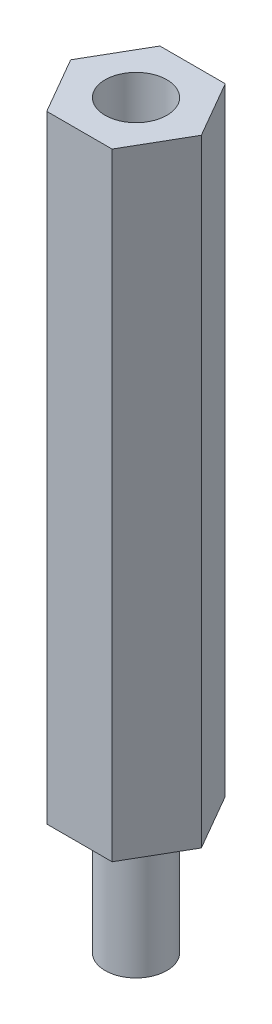
ISO-10303-21;
HEADER;
FILE_DESCRIPTION(('STEP AP214'),'2;1');
FILE_NAME('part.step','',(''),(''),'','','');
FILE_SCHEMA(('AUTOMOTIVE_DESIGN { 1 0 10303 214 1 1 1 1 }'));
ENDSEC;
DATA;
#1=APPLICATION_CONTEXT('core data for automotive mechanical design processes');
#2=APPLICATION_PROTOCOL_DEFINITION('international standard','automotive_design',2000,#1);
#3=PRODUCT_CONTEXT('',#1,'mechanical');
#4=PRODUCT('Part','Part','',(#3));
#5=PRODUCT_RELATED_PRODUCT_CATEGORY('part','',(#4));
#6=PRODUCT_DEFINITION_FORMATION('','',#4);
#7=PRODUCT_DEFINITION_CONTEXT('part definition',#1,'design');
#8=PRODUCT_DEFINITION('design','',#6,#7);
#9=PRODUCT_DEFINITION_SHAPE('','',#8);
#10=(LENGTH_UNIT() NAMED_UNIT(*) SI_UNIT(.MILLI.,.METRE.));
#11=(NAMED_UNIT(*) PLANE_ANGLE_UNIT() SI_UNIT($,.RADIAN.));
#12=(NAMED_UNIT(*) SI_UNIT($,.STERADIAN.) SOLID_ANGLE_UNIT());
#13=UNCERTAINTY_MEASURE_WITH_UNIT(LENGTH_MEASURE(1.E-05),#10,'distance_accuracy_value','');
#14=(GEOMETRIC_REPRESENTATION_CONTEXT(3) GLOBAL_UNCERTAINTY_ASSIGNED_CONTEXT((#13)) GLOBAL_UNIT_ASSIGNED_CONTEXT((#10,
#11,#12)) REPRESENTATION_CONTEXT('',''));
#15=CARTESIAN_POINT('',(0.,0.,0.));
#16=DIRECTION('',(0.,0.,1.));
#17=DIRECTION('',(1.,0.,0.));
#18=AXIS2_PLACEMENT_3D('',#15,#16,#17);
#19=CARTESIAN_POINT('',(1.58771324027146,30.,2.75000000000002));
#20=DIRECTION('',(-0.866025403784438,0.,-0.500000000000001));
#21=DIRECTION('',(-0.500000000000001,0.,0.866025403784438));
#22=AXIS2_PLACEMENT_3D('',#19,#20,#21);
#23=PLANE('',#22);
#24=DIRECTION('',(0.500000000000001,0.,-0.866025403784438));
#25=VECTOR('',#24,1.);
#26=CARTESIAN_POINT('',(1.58771324027146,0.,2.75000000000002));
#27=LINE('',#26,#25);
#28=CARTESIAN_POINT('',(1.58771324027146,0.,2.75000000000002));
#29=VERTEX_POINT('',#28);
#30=CARTESIAN_POINT('',(3.17542648054294,0.,0.));
#31=VERTEX_POINT('',#30);
#32=EDGE_CURVE('E136',#29,#31,#27,.T.);
#33=ORIENTED_EDGE('',*,*,#32,.T.);
#34=DIRECTION('',(0.,-1.,0.));
#35=VECTOR('',#34,1.);
#36=CARTESIAN_POINT('',(3.17542648054294,30.,0.));
#37=LINE('',#36,#35);
#38=CARTESIAN_POINT('',(3.17542648054294,30.,0.));
#39=VERTEX_POINT('',#38);
#40=EDGE_CURVE('E48',#39,#31,#37,.T.);
#41=ORIENTED_EDGE('',*,*,#40,.F.);
#42=DIRECTION('',(0.500000000000001,0.,-0.866025403784438));
#43=VECTOR('',#42,1.);
#44=CARTESIAN_POINT('',(1.58771324027146,30.,2.75000000000002));
#45=LINE('',#44,#43);
#46=CARTESIAN_POINT('',(1.58771324027146,30.,2.75000000000002));
#47=VERTEX_POINT('',#46);
#48=EDGE_CURVE('E153',#47,#39,#45,.T.);
#49=ORIENTED_EDGE('',*,*,#48,.F.);
#50=DIRECTION('',(0.,-1.,0.));
#51=VECTOR('',#50,1.);
#52=CARTESIAN_POINT('',(1.58771324027146,30.,2.75000000000002));
#53=LINE('',#52,#51);
#54=EDGE_CURVE('E132',#47,#29,#53,.T.);
#55=ORIENTED_EDGE('',*,*,#54,.T.);
#56=EDGE_LOOP('',(#33,#41,#49,#55));
#57=FACE_BOUND('',#56,.T.);
#58=ADVANCED_FACE('F45',(#57),#23,.F.);
#59=CARTESIAN_POINT('',(3.17542648054294,30.,0.));
#60=DIRECTION('',(-0.866025403784439,0.,0.5));
#61=DIRECTION('',(0.5,0.,0.866025403784439));
#62=AXIS2_PLACEMENT_3D('',#59,#60,#61);
#63=PLANE('',#62);
#64=DIRECTION('',(-0.5,0.,-0.866025403784439));
#65=VECTOR('',#64,1.);
#66=CARTESIAN_POINT('',(3.17542648054294,0.,0.));
#67=LINE('',#66,#65);
#68=CARTESIAN_POINT('',(1.58771324027146,0.,-2.75000000000002));
#69=VERTEX_POINT('',#68);
#70=EDGE_CURVE('E140',#31,#69,#67,.T.);
#71=ORIENTED_EDGE('',*,*,#70,.T.);
#72=DIRECTION('',(0.,-1.,0.));
#73=VECTOR('',#72,1.);
#74=CARTESIAN_POINT('',(1.58771324027146,30.,-2.75000000000002));
#75=LINE('',#74,#73);
#76=CARTESIAN_POINT('',(1.58771324027146,30.,-2.75000000000002));
#77=VERTEX_POINT('',#76);
#78=EDGE_CURVE('E159',#77,#69,#75,.T.);
#79=ORIENTED_EDGE('',*,*,#78,.F.);
#80=DIRECTION('',(-0.5,0.,-0.866025403784439));
#81=VECTOR('',#80,1.);
#82=CARTESIAN_POINT('',(3.17542648054294,30.,0.));
#83=LINE('',#82,#81);
#84=EDGE_CURVE('E101',#39,#77,#83,.T.);
#85=ORIENTED_EDGE('',*,*,#84,.F.);
#86=ORIENTED_EDGE('',*,*,#40,.T.);
#87=EDGE_LOOP('',(#71,#79,#85,#86));
#88=FACE_BOUND('',#87,.T.);
#89=ADVANCED_FACE('F166',(#88),#63,.F.);
#90=CARTESIAN_POINT('',(1.58771324027146,30.,-2.75000000000002));
#91=DIRECTION('',(0.,0.,1.));
#92=DIRECTION('',(1.,0.,0.));
#93=AXIS2_PLACEMENT_3D('',#90,#91,#92);
#94=PLANE('',#93);
#95=DIRECTION('',(-1.,0.,0.));
#96=VECTOR('',#95,1.);
#97=CARTESIAN_POINT('',(1.58771324027146,0.,-2.75000000000002));
#98=LINE('',#97,#96);
#99=CARTESIAN_POINT('',(-1.58771324027148,0.,-2.75000000000002));
#100=VERTEX_POINT('',#99);
#101=EDGE_CURVE('E144',#69,#100,#98,.T.);
#102=ORIENTED_EDGE('',*,*,#101,.T.);
#103=DIRECTION('',(0.,-1.,0.));
#104=VECTOR('',#103,1.);
#105=CARTESIAN_POINT('',(-1.58771324027148,30.,-2.75000000000002));
#106=LINE('',#105,#104);
#107=CARTESIAN_POINT('',(-1.58771324027148,30.,-2.75000000000002));
#108=VERTEX_POINT('',#107);
#109=EDGE_CURVE('E125',#108,#100,#106,.T.);
#110=ORIENTED_EDGE('',*,*,#109,.F.);
#111=DIRECTION('',(-1.,0.,0.));
#112=VECTOR('',#111,1.);
#113=CARTESIAN_POINT('',(1.58771324027146,30.,-2.75000000000002));
#114=LINE('',#113,#112);
#115=EDGE_CURVE('E114',#77,#108,#114,.T.);
#116=ORIENTED_EDGE('',*,*,#115,.F.);
#117=ORIENTED_EDGE('',*,*,#78,.T.);
#118=EDGE_LOOP('',(#102,#110,#116,#117));
#119=FACE_BOUND('',#118,.T.);
#120=ADVANCED_FACE('F172',(#119),#94,.F.);
#121=CARTESIAN_POINT('',(-1.58771324027148,30.,-2.75000000000002));
#122=DIRECTION('',(0.866025403784439,0.,0.499999999999999));
#123=DIRECTION('',(0.499999999999999,0.,-0.86602540378444));
#124=AXIS2_PLACEMENT_3D('',#121,#122,#123);
#125=PLANE('',#124);
#126=DIRECTION('',(-0.499999999999999,0.,0.866025403784439));
#127=VECTOR('',#126,1.);
#128=CARTESIAN_POINT('',(-1.58771324027148,0.,-2.75000000000002));
#129=LINE('',#128,#127);
#130=CARTESIAN_POINT('',(-3.17542648054296,0.,0.));
#131=VERTEX_POINT('',#130);
#132=EDGE_CURVE('E123',#100,#131,#129,.T.);
#133=ORIENTED_EDGE('',*,*,#132,.T.);
#134=DIRECTION('',(0.,-1.,0.));
#135=VECTOR('',#134,1.);
#136=CARTESIAN_POINT('',(-3.17542648054296,30.,0.));
#137=LINE('',#136,#135);
#138=CARTESIAN_POINT('',(-3.17542648054296,30.,0.));
#139=VERTEX_POINT('',#138);
#140=EDGE_CURVE('E120',#139,#131,#137,.T.);
#141=ORIENTED_EDGE('',*,*,#140,.F.);
#142=DIRECTION('',(-0.499999999999999,0.,0.866025403784439));
#143=VECTOR('',#142,1.);
#144=CARTESIAN_POINT('',(-1.58771324027148,30.,-2.75000000000002));
#145=LINE('',#144,#143);
#146=EDGE_CURVE('E108',#108,#139,#145,.T.);
#147=ORIENTED_EDGE('',*,*,#146,.F.);
#148=ORIENTED_EDGE('',*,*,#109,.T.);
#149=EDGE_LOOP('',(#133,#141,#147,#148));
#150=FACE_BOUND('',#149,.T.);
#151=ADVANCED_FACE('F121',(#150),#125,.F.);
#152=CARTESIAN_POINT('',(-3.17542648054296,30.,0.));
#153=DIRECTION('',(0.866025403784439,0.,-0.5));
#154=DIRECTION('',(-0.5,0.,-0.866025403784439));
#155=AXIS2_PLACEMENT_3D('',#152,#153,#154);
#156=PLANE('',#155);
#157=DIRECTION('',(0.5,0.,0.866025403784439));
#158=VECTOR('',#157,1.);
#159=CARTESIAN_POINT('',(-3.17542648054296,0.,0.));
#160=LINE('',#159,#158);
#161=CARTESIAN_POINT('',(-1.58771324027148,0.,2.75000000000002));
#162=VERTEX_POINT('',#161);
#163=EDGE_CURVE('E86',#131,#162,#160,.T.);
#164=ORIENTED_EDGE('',*,*,#163,.T.);
#165=DIRECTION('',(0.,-1.,0.));
#166=VECTOR('',#165,1.);
#167=CARTESIAN_POINT('',(-1.58771324027148,30.,2.75000000000002));
#168=LINE('',#167,#166);
#169=CARTESIAN_POINT('',(-1.58771324027148,30.,2.75000000000002));
#170=VERTEX_POINT('',#169);
#171=EDGE_CURVE('E126',#170,#162,#168,.T.);
#172=ORIENTED_EDGE('',*,*,#171,.F.);
#173=DIRECTION('',(0.5,0.,0.866025403784439));
#174=VECTOR('',#173,1.);
#175=CARTESIAN_POINT('',(-3.17542648054296,30.,0.));
#176=LINE('',#175,#174);
#177=EDGE_CURVE('E112',#139,#170,#176,.T.);
#178=ORIENTED_EDGE('',*,*,#177,.F.);
#179=ORIENTED_EDGE('',*,*,#140,.T.);
#180=EDGE_LOOP('',(#164,#172,#178,#179));
#181=FACE_BOUND('',#180,.T.);
#182=ADVANCED_FACE('F128',(#181),#156,.F.);
#183=CARTESIAN_POINT('',(-1.58771324027148,30.,2.75000000000002));
#184=DIRECTION('',(0.,0.,-1.));
#185=DIRECTION('',(-1.,0.,0.));
#186=AXIS2_PLACEMENT_3D('',#183,#184,#185);
#187=PLANE('',#186);
#188=DIRECTION('',(1.,0.,0.));
#189=VECTOR('',#188,1.);
#190=CARTESIAN_POINT('',(-1.58771324027148,0.,2.75000000000002));
#191=LINE('',#190,#189);
#192=EDGE_CURVE('E92',#162,#29,#191,.T.);
#193=ORIENTED_EDGE('',*,*,#192,.T.);
#194=ORIENTED_EDGE('',*,*,#54,.F.);
#195=DIRECTION('',(1.,0.,0.));
#196=VECTOR('',#195,1.);
#197=CARTESIAN_POINT('',(-1.58771324027148,30.,2.75000000000002));
#198=LINE('',#197,#196);
#199=EDGE_CURVE('E63',#170,#47,#198,.T.);
#200=ORIENTED_EDGE('',*,*,#199,.F.);
#201=ORIENTED_EDGE('',*,*,#171,.T.);
#202=EDGE_LOOP('',(#193,#194,#200,#201));
#203=FACE_BOUND('',#202,.T.);
#204=ADVANCED_FACE('F210',(#203),#187,.F.);
#205=CARTESIAN_POINT('',(0.,30.,0.));
#206=DIRECTION('',(0.,1.,0.));
#207=DIRECTION('',(0.,0.,1.));
#208=AXIS2_PLACEMENT_3D('',#205,#206,#207);
#209=PLANE('',#208);
#210=CARTESIAN_POINT('',(0.,30.,0.));
#211=DIRECTION('',(0.,1.,0.));
#212=DIRECTION('',(0.,0.,1.));
#213=AXIS2_PLACEMENT_3D('',#210,#211,#212);
#214=CIRCLE('',#213,1.5);
#215=CARTESIAN_POINT('',(0.,30.,1.5));
#216=VERTEX_POINT('',#215);
#217=EDGE_CURVE('E179',#216,#216,#214,.T.);
#218=ORIENTED_EDGE('',*,*,#217,.F.);
#219=EDGE_LOOP('',(#218));
#220=FACE_BOUND('',#219,.T.);
#221=ORIENTED_EDGE('',*,*,#48,.T.);
#222=ORIENTED_EDGE('',*,*,#84,.T.);
#223=ORIENTED_EDGE('',*,*,#115,.T.);
#224=ORIENTED_EDGE('',*,*,#146,.T.);
#225=ORIENTED_EDGE('',*,*,#177,.T.);
#226=ORIENTED_EDGE('',*,*,#199,.T.);
#227=EDGE_LOOP('',(#221,#222,#223,#224,#225,#226));
#228=FACE_BOUND('',#227,.T.);
#229=ADVANCED_FACE('F110',(#220,#228),#209,.T.);
#230=CARTESIAN_POINT('',(0.,0.,0.));
#231=DIRECTION('',(0.,1.,0.));
#232=DIRECTION('',(0.,0.,1.));
#233=AXIS2_PLACEMENT_3D('',#230,#231,#232);
#234=PLANE('',#233);
#235=CARTESIAN_POINT('',(0.,0.,0.));
#236=DIRECTION('',(0.,-1.,0.));
#237=DIRECTION('',(0.,0.,-1.));
#238=AXIS2_PLACEMENT_3D('',#235,#236,#237);
#239=CIRCLE('',#238,1.5);
#240=CARTESIAN_POINT('',(0.,0.,-1.5));
#241=VERTEX_POINT('',#240);
#242=EDGE_CURVE('E11',#241,#241,#239,.T.);
#243=ORIENTED_EDGE('',*,*,#242,.F.);
#244=EDGE_LOOP('',(#243));
#245=FACE_BOUND('',#244,.T.);
#246=ORIENTED_EDGE('',*,*,#32,.F.);
#247=ORIENTED_EDGE('',*,*,#192,.F.);
#248=ORIENTED_EDGE('',*,*,#163,.F.);
#249=ORIENTED_EDGE('',*,*,#132,.F.);
#250=ORIENTED_EDGE('',*,*,#101,.F.);
#251=ORIENTED_EDGE('',*,*,#70,.F.);
#252=EDGE_LOOP('',(#246,#247,#248,#249,#250,#251));
#253=FACE_BOUND('',#252,.T.);
#254=ADVANCED_FACE('F171',(#245,#253),#234,.F.);
#255=CARTESIAN_POINT('',(0.,18.,0.));
#256=DIRECTION('',(0.,1.,0.));
#257=DIRECTION('',(0.,0.,1.));
#258=AXIS2_PLACEMENT_3D('',#255,#256,#257);
#259=CYLINDRICAL_SURFACE('',#258,1.5);
#260=CARTESIAN_POINT('',(0.,18.,0.));
#261=DIRECTION('',(0.,1.,0.));
#262=DIRECTION('',(0.,0.,1.));
#263=AXIS2_PLACEMENT_3D('',#260,#261,#262);
#264=CIRCLE('',#263,1.5);
#265=CARTESIAN_POINT('',(0.,18.,1.5));
#266=VERTEX_POINT('',#265);
#267=EDGE_CURVE('E141',#266,#266,#264,.T.);
#268=ORIENTED_EDGE('',*,*,#267,.F.);
#269=EDGE_LOOP('',(#268));
#270=FACE_BOUND('',#269,.T.);
#271=ORIENTED_EDGE('',*,*,#217,.T.);
#272=EDGE_LOOP('',(#271));
#273=FACE_BOUND('',#272,.T.);
#274=ADVANCED_FACE('F201',(#270,#273),#259,.F.);
#275=CARTESIAN_POINT('',(0.,18.,0.));
#276=DIRECTION('',(0.,1.,0.));
#277=DIRECTION('',(0.,0.,1.));
#278=AXIS2_PLACEMENT_3D('',#275,#276,#277);
#279=PLANE('',#278);
#280=ORIENTED_EDGE('',*,*,#267,.T.);
#281=EDGE_LOOP('',(#280));
#282=FACE_BOUND('',#281,.T.);
#283=ADVANCED_FACE('F196',(#282),#279,.T.);
#284=CARTESIAN_POINT('',(0.,-6.,0.));
#285=DIRECTION('',(0.,1.,0.));
#286=DIRECTION('',(0.,0.,1.));
#287=AXIS2_PLACEMENT_3D('',#284,#285,#286);
#288=CYLINDRICAL_SURFACE('',#287,1.5);
#289=CARTESIAN_POINT('',(0.,-6.,0.));
#290=DIRECTION('',(0.,-1.,0.));
#291=DIRECTION('',(0.,0.,-1.));
#292=AXIS2_PLACEMENT_3D('',#289,#290,#291);
#293=CIRCLE('',#292,1.5);
#294=CARTESIAN_POINT('',(0.,-6.,-1.5));
#295=VERTEX_POINT('',#294);
#296=EDGE_CURVE('E183',#295,#295,#293,.T.);
#297=ORIENTED_EDGE('',*,*,#296,.F.);
#298=EDGE_LOOP('',(#297));
#299=FACE_BOUND('',#298,.T.);
#300=ORIENTED_EDGE('',*,*,#242,.T.);
#301=EDGE_LOOP('',(#300));
#302=FACE_BOUND('',#301,.T.);
#303=ADVANCED_FACE('F193',(#299,#302),#288,.T.);
#304=CARTESIAN_POINT('',(0.,-6.,0.));
#305=DIRECTION('',(0.,-1.,0.));
#306=DIRECTION('',(0.,0.,-1.));
#307=AXIS2_PLACEMENT_3D('',#304,#305,#306);
#308=PLANE('',#307);
#309=ORIENTED_EDGE('',*,*,#296,.T.);
#310=EDGE_LOOP('',(#309));
#311=FACE_BOUND('',#310,.T.);
#312=ADVANCED_FACE('F191',(#311),#308,.T.);
#313=CLOSED_SHELL('',(#58,#89,#120,#151,#182,#204,#229,#254,#274,#283,#303,#312));
#314=MANIFOLD_SOLID_BREP('B2',#313);
#315=ADVANCED_BREP_SHAPE_REPRESENTATION('',(#18,#314),#14);
#316=SHAPE_DEFINITION_REPRESENTATION(#9,#315);
ENDSEC;
END-ISO-10303-21;
